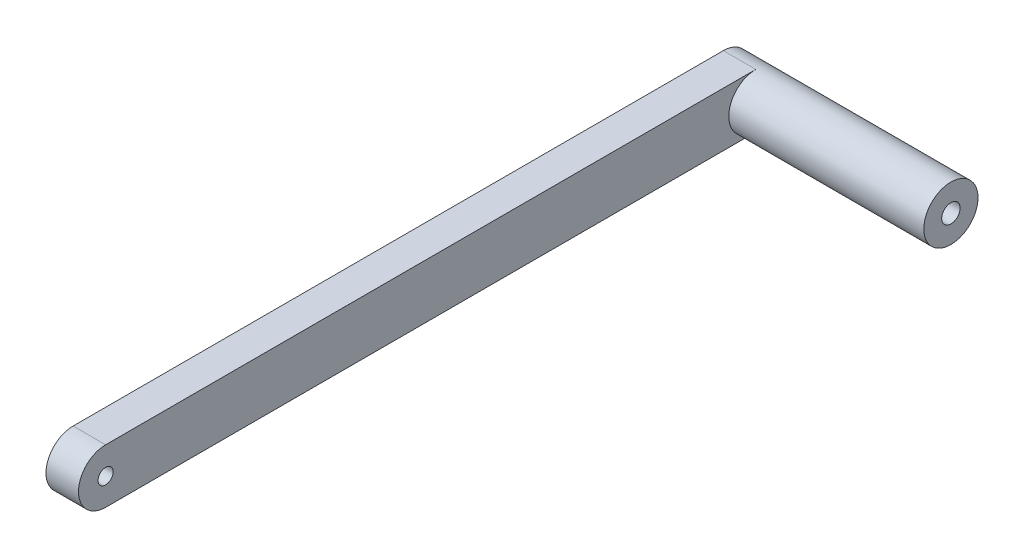
ISO-10303-21;
HEADER;
FILE_DESCRIPTION(('STEP AP214'),'2;1');
FILE_NAME('part.step','',(''),(''),'','','');
FILE_SCHEMA(('AUTOMOTIVE_DESIGN { 1 0 10303 214 1 1 1 1 }'));
ENDSEC;
DATA;
#1=APPLICATION_CONTEXT('core data for automotive mechanical design processes');
#2=APPLICATION_PROTOCOL_DEFINITION('international standard','automotive_design',2000,#1);
#3=PRODUCT_CONTEXT('',#1,'mechanical');
#4=PRODUCT('Part','Part','',(#3));
#5=PRODUCT_RELATED_PRODUCT_CATEGORY('part','',(#4));
#6=PRODUCT_DEFINITION_FORMATION('','',#4);
#7=PRODUCT_DEFINITION_CONTEXT('part definition',#1,'design');
#8=PRODUCT_DEFINITION('design','',#6,#7);
#9=PRODUCT_DEFINITION_SHAPE('','',#8);
#10=(LENGTH_UNIT() NAMED_UNIT(*) SI_UNIT(.MILLI.,.METRE.));
#11=(NAMED_UNIT(*) PLANE_ANGLE_UNIT() SI_UNIT($,.RADIAN.));
#12=(NAMED_UNIT(*) SI_UNIT($,.STERADIAN.) SOLID_ANGLE_UNIT());
#13=UNCERTAINTY_MEASURE_WITH_UNIT(LENGTH_MEASURE(1.E-05),#10,'distance_accuracy_value','');
#14=(GEOMETRIC_REPRESENTATION_CONTEXT(3) GLOBAL_UNCERTAINTY_ASSIGNED_CONTEXT((#13)) GLOBAL_UNIT_ASSIGNED_CONTEXT((#10,
#11,#12)) REPRESENTATION_CONTEXT('',''));
#15=CARTESIAN_POINT('',(0.,0.,0.));
#16=DIRECTION('',(0.,0.,1.));
#17=DIRECTION('',(1.,0.,0.));
#18=AXIS2_PLACEMENT_3D('',#15,#16,#17);
#19=CARTESIAN_POINT('',(3.,0.,30.));
#20=DIRECTION('',(-1.,0.,0.));
#21=DIRECTION('',(0.,0.,1.));
#22=AXIS2_PLACEMENT_3D('',#19,#20,#21);
#23=CYLINDRICAL_SURFACE('',#22,2.5);
#24=CARTESIAN_POINT('',(0.,0.,30.));
#25=DIRECTION('',(1.,0.,0.));
#26=DIRECTION('',(0.,0.,-1.));
#27=AXIS2_PLACEMENT_3D('',#24,#25,#26);
#28=CIRCLE('',#27,2.5);
#29=CARTESIAN_POINT('',(0.,2.5,30.));
#30=VERTEX_POINT('',#29);
#31=CARTESIAN_POINT('',(0.,-2.5,30.));
#32=VERTEX_POINT('',#31);
#33=EDGE_CURVE('E94',#30,#32,#28,.T.);
#34=ORIENTED_EDGE('',*,*,#33,.T.);
#35=DIRECTION('',(-1.,0.,0.));
#36=VECTOR('',#35,1.);
#37=CARTESIAN_POINT('',(3.,-2.5,30.));
#38=LINE('',#37,#36);
#39=CARTESIAN_POINT('',(3.,-2.5,30.));
#40=VERTEX_POINT('',#39);
#41=EDGE_CURVE('E11',#40,#32,#38,.T.);
#42=ORIENTED_EDGE('',*,*,#41,.F.);
#43=CARTESIAN_POINT('',(3.,0.,30.));
#44=DIRECTION('',(1.,0.,0.));
#45=DIRECTION('',(0.,0.,-1.));
#46=AXIS2_PLACEMENT_3D('',#43,#44,#45);
#47=CIRCLE('',#46,2.5);
#48=CARTESIAN_POINT('',(3.,2.5,30.));
#49=VERTEX_POINT('',#48);
#50=EDGE_CURVE('E101',#49,#40,#47,.T.);
#51=ORIENTED_EDGE('',*,*,#50,.F.);
#52=DIRECTION('',(-1.,0.,0.));
#53=VECTOR('',#52,1.);
#54=CARTESIAN_POINT('',(3.,2.5,30.));
#55=LINE('',#54,#53);
#56=EDGE_CURVE('E81',#49,#30,#55,.T.);
#57=ORIENTED_EDGE('',*,*,#56,.T.);
#58=EDGE_LOOP('',(#34,#42,#51,#57));
#59=FACE_BOUND('',#58,.T.);
#60=ADVANCED_FACE('F32',(#59),#23,.T.);
#61=CARTESIAN_POINT('',(3.,-2.5,30.));
#62=DIRECTION('',(0.,1.,0.));
#63=DIRECTION('',(0.,0.,1.));
#64=AXIS2_PLACEMENT_3D('',#61,#62,#63);
#65=PLANE('',#64);
#66=DIRECTION('',(0.,0.,-1.));
#67=VECTOR('',#66,1.);
#68=CARTESIAN_POINT('',(0.,-2.5,30.));
#69=LINE('',#68,#67);
#70=CARTESIAN_POINT('',(0.,-2.49999999999999,-30.));
#71=VERTEX_POINT('',#70);
#72=EDGE_CURVE('E106',#32,#71,#69,.T.);
#73=ORIENTED_EDGE('',*,*,#72,.T.);
#74=DIRECTION('',(-1.,0.,0.));
#75=VECTOR('',#74,1.);
#76=CARTESIAN_POINT('',(3.,-2.49999999999999,-30.));
#77=LINE('',#76,#75);
#78=CARTESIAN_POINT('',(3.,-2.49999999999999,-30.));
#79=VERTEX_POINT('',#78);
#80=EDGE_CURVE('E40',#79,#71,#77,.T.);
#81=ORIENTED_EDGE('',*,*,#80,.F.);
#82=DIRECTION('',(0.,0.,-1.));
#83=VECTOR('',#82,1.);
#84=CARTESIAN_POINT('',(3.,-2.5,30.));
#85=LINE('',#84,#83);
#86=EDGE_CURVE('E77',#40,#79,#85,.T.);
#87=ORIENTED_EDGE('',*,*,#86,.F.);
#88=ORIENTED_EDGE('',*,*,#41,.T.);
#89=EDGE_LOOP('',(#73,#81,#87,#88));
#90=FACE_BOUND('',#89,.T.);
#91=ADVANCED_FACE('F115',(#90),#65,.F.);
#92=CARTESIAN_POINT('',(3.,0.,-30.));
#93=DIRECTION('',(-1.,0.,0.));
#94=DIRECTION('',(0.,0.,1.));
#95=AXIS2_PLACEMENT_3D('',#92,#93,#94);
#96=CYLINDRICAL_SURFACE('',#95,2.5);
#97=CARTESIAN_POINT('',(0.,0.,-30.));
#98=DIRECTION('',(1.,0.,0.));
#99=DIRECTION('',(0.,0.,-1.));
#100=AXIS2_PLACEMENT_3D('',#97,#98,#99);
#101=CIRCLE('',#100,2.5);
#102=CARTESIAN_POINT('',(0.,2.50000000000001,-30.));
#103=VERTEX_POINT('',#102);
#104=EDGE_CURVE('E67',#71,#103,#101,.T.);
#105=ORIENTED_EDGE('',*,*,#104,.T.);
#106=DIRECTION('',(-1.,0.,0.));
#107=VECTOR('',#106,1.);
#108=CARTESIAN_POINT('',(3.,2.50000000000001,-30.));
#109=LINE('',#108,#107);
#110=CARTESIAN_POINT('',(3.,2.50000000000001,-30.));
#111=VERTEX_POINT('',#110);
#112=EDGE_CURVE('E80',#111,#103,#109,.T.);
#113=ORIENTED_EDGE('',*,*,#112,.F.);
#114=CARTESIAN_POINT('',(3.,0.,-30.));
#115=DIRECTION('',(1.,0.,0.));
#116=DIRECTION('',(0.,0.,-1.));
#117=AXIS2_PLACEMENT_3D('',#114,#115,#116);
#118=CIRCLE('',#117,2.5);
#119=EDGE_CURVE('E87',#111,#79,#118,.T.);
#120=ORIENTED_EDGE('',*,*,#119,.T.);
#121=ORIENTED_EDGE('',*,*,#80,.T.);
#122=EDGE_LOOP('',(#105,#113,#120,#121));
#123=FACE_BOUND('',#122,.T.);
#124=CARTESIAN_POINT('',(21.,0.,-30.));
#125=DIRECTION('',(1.,0.,0.));
#126=DIRECTION('',(0.,0.,-1.));
#127=AXIS2_PLACEMENT_3D('',#124,#125,#126);
#128=CIRCLE('',#127,2.5);
#129=CARTESIAN_POINT('',(21.,0.,-32.5));
#130=VERTEX_POINT('',#129);
#131=EDGE_CURVE('E90',#130,#130,#128,.T.);
#132=ORIENTED_EDGE('',*,*,#131,.F.);
#133=EDGE_LOOP('',(#132));
#134=FACE_BOUND('',#133,.T.);
#135=ADVANCED_FACE('F85',(#123,#134),#96,.T.);
#136=CARTESIAN_POINT('',(3.,2.5,30.));
#137=DIRECTION('',(0.,-1.,0.));
#138=DIRECTION('',(0.,0.,-1.));
#139=AXIS2_PLACEMENT_3D('',#136,#137,#138);
#140=PLANE('',#139);
#141=DIRECTION('',(0.,0.,1.));
#142=VECTOR('',#141,1.);
#143=CARTESIAN_POINT('',(0.,2.5,30.));
#144=LINE('',#143,#142);
#145=EDGE_CURVE('E72',#103,#30,#144,.T.);
#146=ORIENTED_EDGE('',*,*,#145,.T.);
#147=ORIENTED_EDGE('',*,*,#56,.F.);
#148=DIRECTION('',(0.,0.,1.));
#149=VECTOR('',#148,1.);
#150=CARTESIAN_POINT('',(3.,2.5,30.));
#151=LINE('',#150,#149);
#152=EDGE_CURVE('E48',#111,#49,#151,.T.);
#153=ORIENTED_EDGE('',*,*,#152,.F.);
#154=ORIENTED_EDGE('',*,*,#112,.T.);
#155=EDGE_LOOP('',(#146,#147,#153,#154));
#156=FACE_BOUND('',#155,.T.);
#157=ADVANCED_FACE('F79',(#156),#140,.F.);
#158=CARTESIAN_POINT('',(3.,0.,30.));
#159=DIRECTION('',(1.,0.,0.));
#160=DIRECTION('',(0.,0.,-1.));
#161=AXIS2_PLACEMENT_3D('',#158,#159,#160);
#162=PLANE('',#161);
#163=CARTESIAN_POINT('',(3.,0.,30.));
#164=DIRECTION('',(1.,0.,0.));
#165=DIRECTION('',(0.,0.,-1.));
#166=AXIS2_PLACEMENT_3D('',#163,#164,#165);
#167=CIRCLE('',#166,0.700000000000002);
#168=CARTESIAN_POINT('',(3.,0.,29.3));
#169=VERTEX_POINT('',#168);
#170=EDGE_CURVE('E150',#169,#169,#167,.T.);
#171=ORIENTED_EDGE('',*,*,#170,.F.);
#172=EDGE_LOOP('',(#171));
#173=FACE_BOUND('',#172,.T.);
#174=ORIENTED_EDGE('',*,*,#119,.F.);
#175=ORIENTED_EDGE('',*,*,#152,.T.);
#176=ORIENTED_EDGE('',*,*,#50,.T.);
#177=ORIENTED_EDGE('',*,*,#86,.T.);
#178=EDGE_LOOP('',(#174,#175,#176,#177));
#179=FACE_BOUND('',#178,.T.);
#180=ADVANCED_FACE('F89',(#173,#179),#162,.T.);
#181=CARTESIAN_POINT('',(0.,0.,30.));
#182=DIRECTION('',(1.,0.,0.));
#183=DIRECTION('',(0.,0.,-1.));
#184=AXIS2_PLACEMENT_3D('',#181,#182,#183);
#185=PLANE('',#184);
#186=CARTESIAN_POINT('',(0.,0.,30.));
#187=DIRECTION('',(1.,0.,0.));
#188=DIRECTION('',(0.,0.,-1.));
#189=AXIS2_PLACEMENT_3D('',#186,#187,#188);
#190=CIRCLE('',#189,0.700000000000002);
#191=CARTESIAN_POINT('',(0.,0.,29.3));
#192=VERTEX_POINT('',#191);
#193=EDGE_CURVE('E147',#192,#192,#190,.T.);
#194=ORIENTED_EDGE('',*,*,#193,.T.);
#195=EDGE_LOOP('',(#194));
#196=FACE_BOUND('',#195,.T.);
#197=CARTESIAN_POINT('',(0.,0.,-30.));
#198=DIRECTION('',(1.,0.,0.));
#199=DIRECTION('',(0.,0.,-1.));
#200=AXIS2_PLACEMENT_3D('',#197,#198,#199);
#201=CIRCLE('',#200,0.850000000000007);
#202=CARTESIAN_POINT('',(0.,0.,-30.85));
#203=VERTEX_POINT('',#202);
#204=EDGE_CURVE('E91',#203,#203,#201,.T.);
#205=ORIENTED_EDGE('',*,*,#204,.T.);
#206=EDGE_LOOP('',(#205));
#207=FACE_BOUND('',#206,.T.);
#208=ORIENTED_EDGE('',*,*,#33,.F.);
#209=ORIENTED_EDGE('',*,*,#145,.F.);
#210=ORIENTED_EDGE('',*,*,#104,.F.);
#211=ORIENTED_EDGE('',*,*,#72,.F.);
#212=EDGE_LOOP('',(#208,#209,#210,#211));
#213=FACE_BOUND('',#212,.T.);
#214=ADVANCED_FACE('F112',(#196,#207,#213),#185,.F.);
#215=CARTESIAN_POINT('',(21.,0.,-30.));
#216=DIRECTION('',(1.,0.,0.));
#217=DIRECTION('',(0.,0.,-1.));
#218=AXIS2_PLACEMENT_3D('',#215,#216,#217);
#219=PLANE('',#218);
#220=CARTESIAN_POINT('',(21.,0.,-30.));
#221=DIRECTION('',(1.,0.,0.));
#222=DIRECTION('',(0.,0.,-1.));
#223=AXIS2_PLACEMENT_3D('',#220,#221,#222);
#224=CIRCLE('',#223,0.850000000000007);
#225=CARTESIAN_POINT('',(21.,0.,-30.85));
#226=VERTEX_POINT('',#225);
#227=EDGE_CURVE('E97',#226,#226,#224,.T.);
#228=ORIENTED_EDGE('',*,*,#227,.F.);
#229=EDGE_LOOP('',(#228));
#230=FACE_BOUND('',#229,.T.);
#231=ORIENTED_EDGE('',*,*,#131,.T.);
#232=EDGE_LOOP('',(#231));
#233=FACE_BOUND('',#232,.T.);
#234=ADVANCED_FACE('F127',(#230,#233),#219,.T.);
#235=CARTESIAN_POINT('',(0.,0.,-30.));
#236=DIRECTION('',(1.,0.,0.));
#237=DIRECTION('',(0.,0.,-1.));
#238=AXIS2_PLACEMENT_3D('',#235,#236,#237);
#239=CYLINDRICAL_SURFACE('',#238,0.850000000000007);
#240=ORIENTED_EDGE('',*,*,#204,.F.);
#241=EDGE_LOOP('',(#240));
#242=FACE_BOUND('',#241,.T.);
#243=ORIENTED_EDGE('',*,*,#227,.T.);
#244=EDGE_LOOP('',(#243));
#245=FACE_BOUND('',#244,.T.);
#246=ADVANCED_FACE('F134',(#242,#245),#239,.F.);
#247=CARTESIAN_POINT('',(0.,0.,30.));
#248=DIRECTION('',(1.,0.,0.));
#249=DIRECTION('',(0.,0.,-1.));
#250=AXIS2_PLACEMENT_3D('',#247,#248,#249);
#251=CYLINDRICAL_SURFACE('',#250,0.700000000000002);
#252=ORIENTED_EDGE('',*,*,#193,.F.);
#253=EDGE_LOOP('',(#252));
#254=FACE_BOUND('',#253,.T.);
#255=ORIENTED_EDGE('',*,*,#170,.T.);
#256=EDGE_LOOP('',(#255));
#257=FACE_BOUND('',#256,.T.);
#258=ADVANCED_FACE('F138',(#254,#257),#251,.F.);
#259=CLOSED_SHELL('',(#60,#91,#135,#157,#180,#214,#234,#246,#258));
#260=MANIFOLD_SOLID_BREP('B2',#259);
#261=ADVANCED_BREP_SHAPE_REPRESENTATION('',(#18,#260),#14);
#262=SHAPE_DEFINITION_REPRESENTATION(#9,#261);
ENDSEC;
END-ISO-10303-21;
